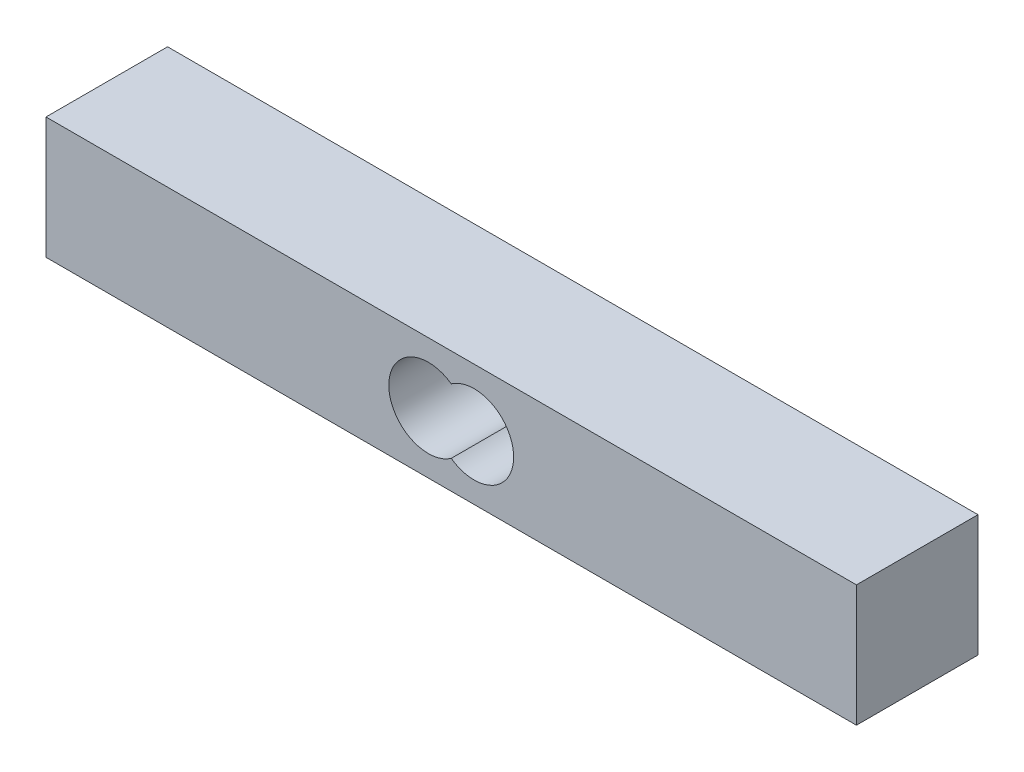
ISO-10303-21;
HEADER;
FILE_DESCRIPTION(('STEP AP214'),'2;1');
FILE_NAME('part.step','',(''),(''),'','','');
FILE_SCHEMA(('AUTOMOTIVE_DESIGN { 1 0 10303 214 1 1 1 1 }'));
ENDSEC;
DATA;
#1=APPLICATION_CONTEXT('core data for automotive mechanical design processes');
#2=APPLICATION_PROTOCOL_DEFINITION('international standard','automotive_design',2000,#1);
#3=PRODUCT_CONTEXT('',#1,'mechanical');
#4=PRODUCT('Part','Part','',(#3));
#5=PRODUCT_RELATED_PRODUCT_CATEGORY('part','',(#4));
#6=PRODUCT_DEFINITION_FORMATION('','',#4);
#7=PRODUCT_DEFINITION_CONTEXT('part definition',#1,'design');
#8=PRODUCT_DEFINITION('design','',#6,#7);
#9=PRODUCT_DEFINITION_SHAPE('','',#8);
#10=(LENGTH_UNIT() NAMED_UNIT(*) SI_UNIT(.MILLI.,.METRE.));
#11=(NAMED_UNIT(*) PLANE_ANGLE_UNIT() SI_UNIT($,.RADIAN.));
#12=(NAMED_UNIT(*) SI_UNIT($,.STERADIAN.) SOLID_ANGLE_UNIT());
#13=UNCERTAINTY_MEASURE_WITH_UNIT(LENGTH_MEASURE(1.E-05),#10,'distance_accuracy_value','');
#14=(GEOMETRIC_REPRESENTATION_CONTEXT(3) GLOBAL_UNCERTAINTY_ASSIGNED_CONTEXT((#13)) GLOBAL_UNIT_ASSIGNED_CONTEXT((#10,
#11,#12)) REPRESENTATION_CONTEXT('',''));
#15=CARTESIAN_POINT('',(0.,0.,0.));
#16=DIRECTION('',(0.,0.,1.));
#17=DIRECTION('',(1.,0.,0.));
#18=AXIS2_PLACEMENT_3D('',#15,#16,#17);
#19=CARTESIAN_POINT('',(0.,12.,0.));
#20=DIRECTION('',(1.,0.,0.));
#21=DIRECTION('',(0.,0.,-1.));
#22=AXIS2_PLACEMENT_3D('',#19,#20,#21);
#23=PLANE('',#22);
#24=DIRECTION('',(0.,0.,1.));
#25=VECTOR('',#24,1.);
#26=CARTESIAN_POINT('',(0.,0.,0.));
#27=LINE('',#26,#25);
#28=CARTESIAN_POINT('',(0.,0.,-12.));
#29=VERTEX_POINT('',#28);
#30=CARTESIAN_POINT('',(0.,0.,0.));
#31=VERTEX_POINT('',#30);
#32=EDGE_CURVE('E100',#29,#31,#27,.T.);
#33=ORIENTED_EDGE('',*,*,#32,.T.);
#34=DIRECTION('',(0.,-1.,0.));
#35=VECTOR('',#34,1.);
#36=CARTESIAN_POINT('',(0.,12.,0.));
#37=LINE('',#36,#35);
#38=CARTESIAN_POINT('',(0.,12.,0.));
#39=VERTEX_POINT('',#38);
#40=EDGE_CURVE('E11',#39,#31,#37,.T.);
#41=ORIENTED_EDGE('',*,*,#40,.F.);
#42=DIRECTION('',(0.,0.,1.));
#43=VECTOR('',#42,1.);
#44=CARTESIAN_POINT('',(0.,12.,0.));
#45=LINE('',#44,#43);
#46=CARTESIAN_POINT('',(0.,12.,-12.));
#47=VERTEX_POINT('',#46);
#48=EDGE_CURVE('E102',#47,#39,#45,.T.);
#49=ORIENTED_EDGE('',*,*,#48,.F.);
#50=DIRECTION('',(0.,-1.,0.));
#51=VECTOR('',#50,1.);
#52=CARTESIAN_POINT('',(0.,12.,-12.));
#53=LINE('',#52,#51);
#54=EDGE_CURVE('E112',#47,#29,#53,.T.);
#55=ORIENTED_EDGE('',*,*,#54,.T.);
#56=EDGE_LOOP('',(#33,#41,#49,#55));
#57=FACE_BOUND('',#56,.T.);
#58=ADVANCED_FACE('F32',(#57),#23,.F.);
#59=CARTESIAN_POINT('',(0.,12.,0.));
#60=DIRECTION('',(0.,0.,-1.));
#61=DIRECTION('',(-1.,0.,0.));
#62=AXIS2_PLACEMENT_3D('',#59,#60,#61);
#63=PLANE('',#62);
#64=CARTESIAN_POINT('',(42.2583668361227,6.,0.));
#65=DIRECTION('',(0.,0.,1.));
#66=DIRECTION('',(1.,0.,0.));
#67=AXIS2_PLACEMENT_3D('',#64,#65,#66);
#68=CIRCLE('',#67,3.90513009474306);
#69=CARTESIAN_POINT('',(40.,2.8141217395561,0.));
#70=VERTEX_POINT('',#69);
#71=CARTESIAN_POINT('',(40.,9.1858782604439,0.));
#72=VERTEX_POINT('',#71);
#73=EDGE_CURVE('E95',#70,#72,#68,.T.);
#74=ORIENTED_EDGE('',*,*,#73,.F.);
#75=CARTESIAN_POINT('',(37.7416331638773,6.,0.));
#76=DIRECTION('',(0.,0.,1.));
#77=DIRECTION('',(-1.,0.,0.));
#78=AXIS2_PLACEMENT_3D('',#75,#76,#77);
#79=CIRCLE('',#78,3.90513009474306);
#80=EDGE_CURVE('E46',#72,#70,#79,.T.);
#81=ORIENTED_EDGE('',*,*,#80,.F.);
#82=EDGE_LOOP('',(#74,#81));
#83=FACE_BOUND('',#82,.T.);
#84=DIRECTION('',(1.,0.,0.));
#85=VECTOR('',#84,1.);
#86=CARTESIAN_POINT('',(0.,0.,0.));
#87=LINE('',#86,#85);
#88=CARTESIAN_POINT('',(80.,0.,0.));
#89=VERTEX_POINT('',#88);
#90=EDGE_CURVE('E115',#31,#89,#87,.T.);
#91=ORIENTED_EDGE('',*,*,#90,.T.);
#92=DIRECTION('',(0.,-1.,0.));
#93=VECTOR('',#92,1.);
#94=CARTESIAN_POINT('',(80.,12.,0.));
#95=LINE('',#94,#93);
#96=CARTESIAN_POINT('',(80.,12.,0.));
#97=VERTEX_POINT('',#96);
#98=EDGE_CURVE('E39',#97,#89,#95,.T.);
#99=ORIENTED_EDGE('',*,*,#98,.F.);
#100=DIRECTION('',(1.,0.,0.));
#101=VECTOR('',#100,1.);
#102=CARTESIAN_POINT('',(0.,12.,0.));
#103=LINE('',#102,#101);
#104=EDGE_CURVE('E105',#39,#97,#103,.T.);
#105=ORIENTED_EDGE('',*,*,#104,.F.);
#106=ORIENTED_EDGE('',*,*,#40,.T.);
#107=EDGE_LOOP('',(#91,#99,#105,#106));
#108=FACE_BOUND('',#107,.T.);
#109=ADVANCED_FACE('F143',(#83,#108),#63,.F.);
#110=CARTESIAN_POINT('',(80.,12.,0.));
#111=DIRECTION('',(-1.,0.,0.));
#112=DIRECTION('',(0.,0.,1.));
#113=AXIS2_PLACEMENT_3D('',#110,#111,#112);
#114=PLANE('',#113);
#115=DIRECTION('',(0.,0.,-1.));
#116=VECTOR('',#115,1.);
#117=CARTESIAN_POINT('',(80.,0.,0.));
#118=LINE('',#117,#116);
#119=CARTESIAN_POINT('',(80.,0.,-12.));
#120=VERTEX_POINT('',#119);
#121=EDGE_CURVE('E117',#89,#120,#118,.T.);
#122=ORIENTED_EDGE('',*,*,#121,.T.);
#123=DIRECTION('',(0.,-1.,0.));
#124=VECTOR('',#123,1.);
#125=CARTESIAN_POINT('',(80.,12.,-12.));
#126=LINE('',#125,#124);
#127=CARTESIAN_POINT('',(80.,12.,-12.));
#128=VERTEX_POINT('',#127);
#129=EDGE_CURVE('E122',#128,#120,#126,.T.);
#130=ORIENTED_EDGE('',*,*,#129,.F.);
#131=DIRECTION('',(0.,0.,-1.));
#132=VECTOR('',#131,1.);
#133=CARTESIAN_POINT('',(80.,12.,0.));
#134=LINE('',#133,#132);
#135=EDGE_CURVE('E108',#97,#128,#134,.T.);
#136=ORIENTED_EDGE('',*,*,#135,.F.);
#137=ORIENTED_EDGE('',*,*,#98,.T.);
#138=EDGE_LOOP('',(#122,#130,#136,#137));
#139=FACE_BOUND('',#138,.T.);
#140=ADVANCED_FACE('F129',(#139),#114,.F.);
#141=CARTESIAN_POINT('',(0.,12.,-12.));
#142=DIRECTION('',(0.,0.,1.));
#143=DIRECTION('',(1.,0.,0.));
#144=AXIS2_PLACEMENT_3D('',#141,#142,#143);
#145=PLANE('',#144);
#146=CARTESIAN_POINT('',(42.2583668361227,6.,-12.));
#147=DIRECTION('',(0.,0.,1.));
#148=DIRECTION('',(1.,0.,0.));
#149=AXIS2_PLACEMENT_3D('',#146,#147,#148);
#150=CIRCLE('',#149,3.90513009474306);
#151=CARTESIAN_POINT('',(40.,2.8141217395561,-12.));
#152=VERTEX_POINT('',#151);
#153=CARTESIAN_POINT('',(40.,9.1858782604439,-12.));
#154=VERTEX_POINT('',#153);
#155=EDGE_CURVE('E87',#152,#154,#150,.T.);
#156=ORIENTED_EDGE('',*,*,#155,.T.);
#157=CARTESIAN_POINT('',(37.7416331638773,6.,-12.));
#158=DIRECTION('',(0.,0.,1.));
#159=DIRECTION('',(-1.,0.,0.));
#160=AXIS2_PLACEMENT_3D('',#157,#158,#159);
#161=CIRCLE('',#160,3.90513009474306);
#162=EDGE_CURVE('E51',#154,#152,#161,.T.);
#163=ORIENTED_EDGE('',*,*,#162,.T.);
#164=EDGE_LOOP('',(#156,#163));
#165=FACE_BOUND('',#164,.T.);
#166=DIRECTION('',(-1.,0.,0.));
#167=VECTOR('',#166,1.);
#168=CARTESIAN_POINT('',(0.,0.,-12.));
#169=LINE('',#168,#167);
#170=EDGE_CURVE('E106',#120,#29,#169,.T.);
#171=ORIENTED_EDGE('',*,*,#170,.T.);
#172=ORIENTED_EDGE('',*,*,#54,.F.);
#173=DIRECTION('',(-1.,0.,0.));
#174=VECTOR('',#173,1.);
#175=CARTESIAN_POINT('',(0.,12.,-12.));
#176=LINE('',#175,#174);
#177=EDGE_CURVE('E110',#128,#47,#176,.T.);
#178=ORIENTED_EDGE('',*,*,#177,.F.);
#179=ORIENTED_EDGE('',*,*,#129,.T.);
#180=EDGE_LOOP('',(#171,#172,#178,#179));
#181=FACE_BOUND('',#180,.T.);
#182=ADVANCED_FACE('F93',(#165,#181),#145,.F.);
#183=CARTESIAN_POINT('',(0.,12.,0.));
#184=DIRECTION('',(0.,-1.,0.));
#185=DIRECTION('',(0.,0.,-1.));
#186=AXIS2_PLACEMENT_3D('',#183,#184,#185);
#187=PLANE('',#186);
#188=ORIENTED_EDGE('',*,*,#48,.T.);
#189=ORIENTED_EDGE('',*,*,#104,.T.);
#190=ORIENTED_EDGE('',*,*,#135,.T.);
#191=ORIENTED_EDGE('',*,*,#177,.T.);
#192=EDGE_LOOP('',(#188,#189,#190,#191));
#193=FACE_BOUND('',#192,.T.);
#194=ADVANCED_FACE('F142',(#193),#187,.F.);
#195=CARTESIAN_POINT('',(0.,0.,0.));
#196=DIRECTION('',(0.,-1.,0.));
#197=DIRECTION('',(0.,0.,-1.));
#198=AXIS2_PLACEMENT_3D('',#195,#196,#197);
#199=PLANE('',#198);
#200=ORIENTED_EDGE('',*,*,#32,.F.);
#201=ORIENTED_EDGE('',*,*,#170,.F.);
#202=ORIENTED_EDGE('',*,*,#121,.F.);
#203=ORIENTED_EDGE('',*,*,#90,.F.);
#204=EDGE_LOOP('',(#200,#201,#202,#203));
#205=FACE_BOUND('',#204,.T.);
#206=ADVANCED_FACE('F135',(#205),#199,.T.);
#207=CARTESIAN_POINT('',(37.7416331638773,6.,-12.));
#208=DIRECTION('',(0.,0.,1.));
#209=DIRECTION('',(1.,0.,0.));
#210=AXIS2_PLACEMENT_3D('',#207,#208,#209);
#211=CYLINDRICAL_SURFACE('',#210,3.90513009474306);
#212=ORIENTED_EDGE('',*,*,#80,.T.);
#213=DIRECTION('',(0.,0.,1.));
#214=VECTOR('',#213,1.);
#215=CARTESIAN_POINT('',(40.,2.8141217395561,-12.));
#216=LINE('',#215,#214);
#217=EDGE_CURVE('E80',#152,#70,#216,.T.);
#218=ORIENTED_EDGE('',*,*,#217,.F.);
#219=ORIENTED_EDGE('',*,*,#162,.F.);
#220=DIRECTION('',(0.,0.,1.));
#221=VECTOR('',#220,1.);
#222=CARTESIAN_POINT('',(40.,9.1858782604439,-12.));
#223=LINE('',#222,#221);
#224=EDGE_CURVE('E86',#154,#72,#223,.T.);
#225=ORIENTED_EDGE('',*,*,#224,.T.);
#226=EDGE_LOOP('',(#212,#218,#219,#225));
#227=FACE_BOUND('',#226,.T.);
#228=ADVANCED_FACE('F82',(#227),#211,.F.);
#229=CARTESIAN_POINT('',(42.2583668361227,6.,-12.));
#230=DIRECTION('',(0.,0.,1.));
#231=DIRECTION('',(1.,0.,0.));
#232=AXIS2_PLACEMENT_3D('',#229,#230,#231);
#233=CYLINDRICAL_SURFACE('',#232,3.90513009474306);
#234=ORIENTED_EDGE('',*,*,#73,.T.);
#235=ORIENTED_EDGE('',*,*,#224,.F.);
#236=ORIENTED_EDGE('',*,*,#155,.F.);
#237=ORIENTED_EDGE('',*,*,#217,.T.);
#238=EDGE_LOOP('',(#234,#235,#236,#237));
#239=FACE_BOUND('',#238,.T.);
#240=ADVANCED_FACE('F90',(#239),#233,.F.);
#241=CLOSED_SHELL('',(#58,#109,#140,#182,#194,#206,#228,#240));
#242=MANIFOLD_SOLID_BREP('B2',#241);
#243=ADVANCED_BREP_SHAPE_REPRESENTATION('',(#18,#242),#14);
#244=SHAPE_DEFINITION_REPRESENTATION(#9,#243);
ENDSEC;
END-ISO-10303-21;
